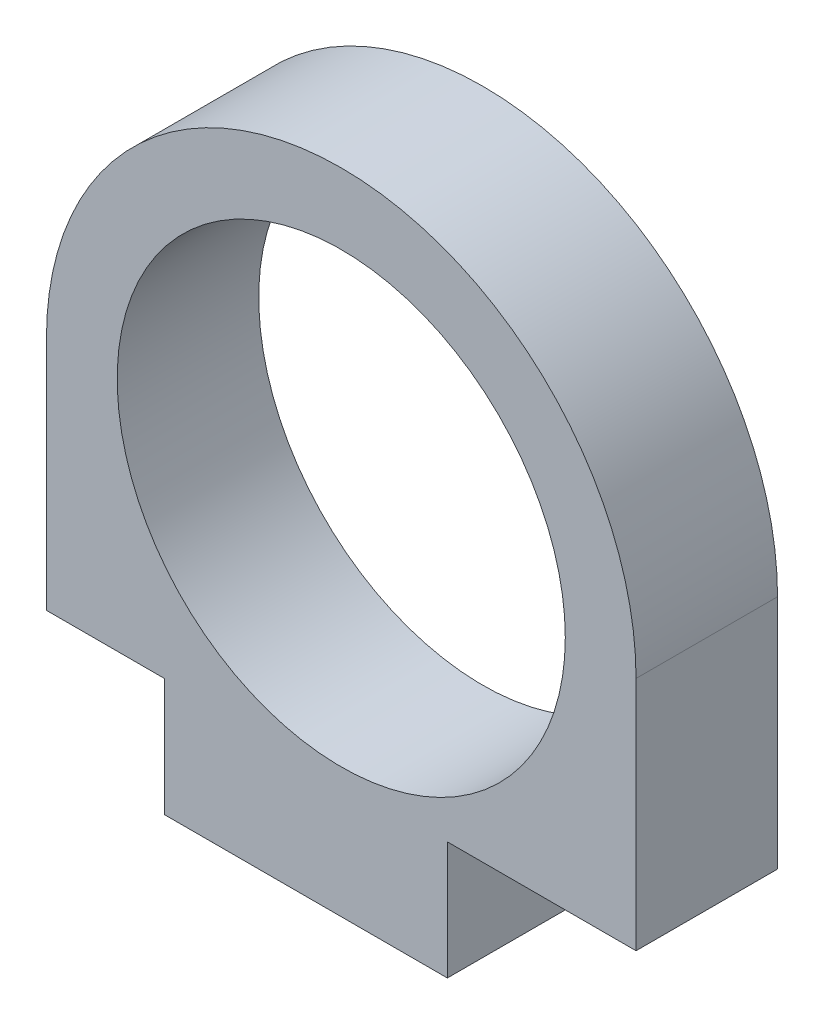
ISO-10303-21;
HEADER;
FILE_DESCRIPTION(('STEP AP214'),'2;1');
FILE_NAME('part.step','',(''),(''),'','','');
FILE_SCHEMA(('AUTOMOTIVE_DESIGN { 1 0 10303 214 1 1 1 1 }'));
ENDSEC;
DATA;
#1=APPLICATION_CONTEXT('core data for automotive mechanical design processes');
#2=APPLICATION_PROTOCOL_DEFINITION('international standard','automotive_design',2000,#1);
#3=PRODUCT_CONTEXT('',#1,'mechanical');
#4=PRODUCT('Part','Part','',(#3));
#5=PRODUCT_RELATED_PRODUCT_CATEGORY('part','',(#4));
#6=PRODUCT_DEFINITION_FORMATION('','',#4);
#7=PRODUCT_DEFINITION_CONTEXT('part definition',#1,'design');
#8=PRODUCT_DEFINITION('design','',#6,#7);
#9=PRODUCT_DEFINITION_SHAPE('','',#8);
#10=(LENGTH_UNIT() NAMED_UNIT(*) SI_UNIT(.MILLI.,.METRE.));
#11=(NAMED_UNIT(*) PLANE_ANGLE_UNIT() SI_UNIT($,.RADIAN.));
#12=(NAMED_UNIT(*) SI_UNIT($,.STERADIAN.) SOLID_ANGLE_UNIT());
#13=UNCERTAINTY_MEASURE_WITH_UNIT(LENGTH_MEASURE(1.E-05),#10,'distance_accuracy_value','');
#14=(GEOMETRIC_REPRESENTATION_CONTEXT(3) GLOBAL_UNCERTAINTY_ASSIGNED_CONTEXT((#13)) GLOBAL_UNIT_ASSIGNED_CONTEXT((#10,
#11,#12)) REPRESENTATION_CONTEXT('',''));
#15=CARTESIAN_POINT('',(0.,0.,0.));
#16=DIRECTION('',(0.,0.,1.));
#17=DIRECTION('',(1.,0.,0.));
#18=AXIS2_PLACEMENT_3D('',#15,#16,#17);
#19=CARTESIAN_POINT('',(0.,-10.,6.));
#20=DIRECTION('',(0.,1.,0.));
#21=DIRECTION('',(0.,0.,1.));
#22=AXIS2_PLACEMENT_3D('',#19,#20,#21);
#23=PLANE('',#22);
#24=DIRECTION('',(1.,0.,0.));
#25=VECTOR('',#24,1.);
#26=CARTESIAN_POINT('',(0.,-10.,0.));
#27=LINE('',#26,#25);
#28=CARTESIAN_POINT('',(-12.5,-10.,0.));
#29=VERTEX_POINT('',#28);
#30=CARTESIAN_POINT('',(-7.5,-10.,0.));
#31=VERTEX_POINT('',#30);
#32=EDGE_CURVE('E139',#29,#31,#27,.T.);
#33=ORIENTED_EDGE('',*,*,#32,.T.);
#34=DIRECTION('',(0.,0.,-1.));
#35=VECTOR('',#34,1.);
#36=CARTESIAN_POINT('',(-7.5,-10.,6.));
#37=LINE('',#36,#35);
#38=CARTESIAN_POINT('',(-7.5,-10.,6.));
#39=VERTEX_POINT('',#38);
#40=EDGE_CURVE('E11',#39,#31,#37,.T.);
#41=ORIENTED_EDGE('',*,*,#40,.F.);
#42=DIRECTION('',(1.,0.,0.));
#43=VECTOR('',#42,1.);
#44=CARTESIAN_POINT('',(0.,-10.,6.));
#45=LINE('',#44,#43);
#46=CARTESIAN_POINT('',(-12.5,-10.,6.));
#47=VERTEX_POINT('',#46);
#48=EDGE_CURVE('E130',#47,#39,#45,.T.);
#49=ORIENTED_EDGE('',*,*,#48,.F.);
#50=DIRECTION('',(0.,0.,-1.));
#51=VECTOR('',#50,1.);
#52=CARTESIAN_POINT('',(-12.5,-10.,6.));
#53=LINE('',#52,#51);
#54=EDGE_CURVE('E135',#47,#29,#53,.T.);
#55=ORIENTED_EDGE('',*,*,#54,.T.);
#56=EDGE_LOOP('',(#33,#41,#49,#55));
#57=FACE_BOUND('',#56,.T.);
#58=ADVANCED_FACE('F35',(#57),#23,.F.);
#59=CARTESIAN_POINT('',(-7.5,0.,6.));
#60=DIRECTION('',(1.,0.,0.));
#61=DIRECTION('',(0.,1.,0.));
#62=AXIS2_PLACEMENT_3D('',#59,#60,#61);
#63=PLANE('',#62);
#64=DIRECTION('',(0.,-1.,0.));
#65=VECTOR('',#64,1.);
#66=CARTESIAN_POINT('',(-7.5,0.,0.));
#67=LINE('',#66,#65);
#68=CARTESIAN_POINT('',(-7.5,-15.,0.));
#69=VERTEX_POINT('',#68);
#70=EDGE_CURVE('E142',#31,#69,#67,.T.);
#71=ORIENTED_EDGE('',*,*,#70,.T.);
#72=DIRECTION('',(0.,0.,-1.));
#73=VECTOR('',#72,1.);
#74=CARTESIAN_POINT('',(-7.5,-15.,6.));
#75=LINE('',#74,#73);
#76=CARTESIAN_POINT('',(-7.5,-15.,6.));
#77=VERTEX_POINT('',#76);
#78=EDGE_CURVE('E44',#77,#69,#75,.T.);
#79=ORIENTED_EDGE('',*,*,#78,.F.);
#80=DIRECTION('',(0.,-1.,0.));
#81=VECTOR('',#80,1.);
#82=CARTESIAN_POINT('',(-7.5,0.,6.));
#83=LINE('',#82,#81);
#84=EDGE_CURVE('E94',#39,#77,#83,.T.);
#85=ORIENTED_EDGE('',*,*,#84,.F.);
#86=ORIENTED_EDGE('',*,*,#40,.T.);
#87=EDGE_LOOP('',(#71,#79,#85,#86));
#88=FACE_BOUND('',#87,.T.);
#89=ADVANCED_FACE('F195',(#88),#63,.F.);
#90=CARTESIAN_POINT('',(0.,-15.,6.));
#91=DIRECTION('',(0.,1.,0.));
#92=DIRECTION('',(0.,0.,1.));
#93=AXIS2_PLACEMENT_3D('',#90,#91,#92);
#94=PLANE('',#93);
#95=DIRECTION('',(1.,0.,0.));
#96=VECTOR('',#95,1.);
#97=CARTESIAN_POINT('',(0.,-15.,0.));
#98=LINE('',#97,#96);
#99=CARTESIAN_POINT('',(4.5,-15.,0.));
#100=VERTEX_POINT('',#99);
#101=EDGE_CURVE('E145',#69,#100,#98,.T.);
#102=ORIENTED_EDGE('',*,*,#101,.T.);
#103=DIRECTION('',(0.,0.,-1.));
#104=VECTOR('',#103,1.);
#105=CARTESIAN_POINT('',(4.5,-15.,6.));
#106=LINE('',#105,#104);
#107=CARTESIAN_POINT('',(4.5,-15.,6.));
#108=VERTEX_POINT('',#107);
#109=EDGE_CURVE('E160',#108,#100,#106,.T.);
#110=ORIENTED_EDGE('',*,*,#109,.F.);
#111=DIRECTION('',(1.,0.,0.));
#112=VECTOR('',#111,1.);
#113=CARTESIAN_POINT('',(0.,-15.,6.));
#114=LINE('',#113,#112);
#115=EDGE_CURVE('E167',#77,#108,#114,.T.);
#116=ORIENTED_EDGE('',*,*,#115,.F.);
#117=ORIENTED_EDGE('',*,*,#78,.T.);
#118=EDGE_LOOP('',(#102,#110,#116,#117));
#119=FACE_BOUND('',#118,.T.);
#120=ADVANCED_FACE('F165',(#119),#94,.F.);
#121=CARTESIAN_POINT('',(4.5,0.,6.));
#122=DIRECTION('',(1.,0.,0.));
#123=DIRECTION('',(0.,0.,-1.));
#124=AXIS2_PLACEMENT_3D('',#121,#122,#123);
#125=PLANE('',#124);
#126=DIRECTION('',(0.,-1.,0.));
#127=VECTOR('',#126,1.);
#128=CARTESIAN_POINT('',(4.5,0.,0.));
#129=LINE('',#128,#127);
#130=CARTESIAN_POINT('',(4.5,-10.,0.));
#131=VERTEX_POINT('',#130);
#132=EDGE_CURVE('E148',#131,#100,#129,.T.);
#133=ORIENTED_EDGE('',*,*,#132,.F.);
#134=DIRECTION('',(0.,0.,-1.));
#135=VECTOR('',#134,1.);
#136=CARTESIAN_POINT('',(4.5,-10.,6.));
#137=LINE('',#136,#135);
#138=CARTESIAN_POINT('',(4.5,-10.,6.));
#139=VERTEX_POINT('',#138);
#140=EDGE_CURVE('E158',#139,#131,#137,.T.);
#141=ORIENTED_EDGE('',*,*,#140,.F.);
#142=DIRECTION('',(0.,-1.,0.));
#143=VECTOR('',#142,1.);
#144=CARTESIAN_POINT('',(4.5,0.,6.));
#145=LINE('',#144,#143);
#146=EDGE_CURVE('E128',#139,#108,#145,.T.);
#147=ORIENTED_EDGE('',*,*,#146,.T.);
#148=ORIENTED_EDGE('',*,*,#109,.T.);
#149=EDGE_LOOP('',(#133,#141,#147,#148));
#150=FACE_BOUND('',#149,.T.);
#151=ADVANCED_FACE('F175',(#150),#125,.T.);
#152=CARTESIAN_POINT('',(12.5,-10.,0.));
#153=VERTEX_POINT('',#152);
#154=EDGE_CURVE('E143',#131,#153,#27,.T.);
#155=ORIENTED_EDGE('',*,*,#154,.T.);
#156=DIRECTION('',(0.,0.,-1.));
#157=VECTOR('',#156,1.);
#158=CARTESIAN_POINT('',(12.5,-10.,6.));
#159=LINE('',#158,#157);
#160=CARTESIAN_POINT('',(12.5,-10.,6.));
#161=VERTEX_POINT('',#160);
#162=EDGE_CURVE('E116',#161,#153,#159,.T.);
#163=ORIENTED_EDGE('',*,*,#162,.F.);
#164=EDGE_CURVE('E125',#139,#161,#45,.T.);
#165=ORIENTED_EDGE('',*,*,#164,.F.);
#166=ORIENTED_EDGE('',*,*,#140,.T.);
#167=EDGE_LOOP('',(#155,#163,#165,#166));
#168=FACE_BOUND('',#167,.T.);
#169=ADVANCED_FACE('F198',(#168),#23,.F.);
#170=CARTESIAN_POINT('',(12.5,0.,6.));
#171=DIRECTION('',(1.,0.,0.));
#172=DIRECTION('',(0.,1.,0.));
#173=AXIS2_PLACEMENT_3D('',#170,#171,#172);
#174=PLANE('',#173);
#175=DIRECTION('',(0.,-1.,0.));
#176=VECTOR('',#175,1.);
#177=CARTESIAN_POINT('',(12.5,0.,0.));
#178=LINE('',#177,#176);
#179=CARTESIAN_POINT('',(12.5,0.,0.));
#180=VERTEX_POINT('',#179);
#181=EDGE_CURVE('E115',#180,#153,#178,.T.);
#182=ORIENTED_EDGE('',*,*,#181,.F.);
#183=DIRECTION('',(0.,0.,-1.));
#184=VECTOR('',#183,1.);
#185=CARTESIAN_POINT('',(12.5,0.,6.));
#186=LINE('',#185,#184);
#187=CARTESIAN_POINT('',(12.5,0.,6.));
#188=VERTEX_POINT('',#187);
#189=EDGE_CURVE('E109',#188,#180,#186,.T.);
#190=ORIENTED_EDGE('',*,*,#189,.F.);
#191=DIRECTION('',(0.,-1.,0.));
#192=VECTOR('',#191,1.);
#193=CARTESIAN_POINT('',(12.5,0.,6.));
#194=LINE('',#193,#192);
#195=EDGE_CURVE('E113',#188,#161,#194,.T.);
#196=ORIENTED_EDGE('',*,*,#195,.T.);
#197=ORIENTED_EDGE('',*,*,#162,.T.);
#198=EDGE_LOOP('',(#182,#190,#196,#197));
#199=FACE_BOUND('',#198,.T.);
#200=ADVANCED_FACE('F111',(#199),#174,.T.);
#201=CARTESIAN_POINT('',(0.,0.,6.));
#202=DIRECTION('',(0.,0.,-1.));
#203=DIRECTION('',(-1.,0.,0.));
#204=AXIS2_PLACEMENT_3D('',#201,#202,#203);
#205=CYLINDRICAL_SURFACE('',#204,12.5);
#206=CARTESIAN_POINT('',(0.,0.,0.));
#207=DIRECTION('',(0.,0.,1.));
#208=DIRECTION('',(1.,0.,0.));
#209=AXIS2_PLACEMENT_3D('',#206,#207,#208);
#210=CIRCLE('',#209,12.5);
#211=CARTESIAN_POINT('',(-12.5,0.,0.));
#212=VERTEX_POINT('',#211);
#213=EDGE_CURVE('E80',#180,#212,#210,.T.);
#214=ORIENTED_EDGE('',*,*,#213,.T.);
#215=DIRECTION('',(0.,0.,-1.));
#216=VECTOR('',#215,1.);
#217=CARTESIAN_POINT('',(-12.5,0.,6.));
#218=LINE('',#217,#216);
#219=CARTESIAN_POINT('',(-12.5,0.,6.));
#220=VERTEX_POINT('',#219);
#221=EDGE_CURVE('E117',#220,#212,#218,.T.);
#222=ORIENTED_EDGE('',*,*,#221,.F.);
#223=CARTESIAN_POINT('',(0.,0.,6.));
#224=DIRECTION('',(0.,0.,1.));
#225=DIRECTION('',(1.,0.,0.));
#226=AXIS2_PLACEMENT_3D('',#223,#224,#225);
#227=CIRCLE('',#226,12.5);
#228=EDGE_CURVE('E119',#188,#220,#227,.T.);
#229=ORIENTED_EDGE('',*,*,#228,.F.);
#230=ORIENTED_EDGE('',*,*,#189,.T.);
#231=EDGE_LOOP('',(#214,#222,#229,#230));
#232=FACE_BOUND('',#231,.T.);
#233=ADVANCED_FACE('F120',(#232),#205,.T.);
#234=CARTESIAN_POINT('',(0.,0.,6.));
#235=DIRECTION('',(0.,0.,-1.));
#236=DIRECTION('',(-1.,0.,0.));
#237=AXIS2_PLACEMENT_3D('',#234,#235,#236);
#238=CYLINDRICAL_SURFACE('',#237,9.5);
#239=CARTESIAN_POINT('',(0.,0.,6.));
#240=DIRECTION('',(0.,0.,1.));
#241=DIRECTION('',(1.,0.,0.));
#242=AXIS2_PLACEMENT_3D('',#239,#240,#241);
#243=CIRCLE('',#242,9.5);
#244=CARTESIAN_POINT('',(9.5,0.,6.));
#245=VERTEX_POINT('',#244);
#246=EDGE_CURVE('E154',#245,#245,#243,.T.);
#247=ORIENTED_EDGE('',*,*,#246,.T.);
#248=EDGE_LOOP('',(#247));
#249=FACE_BOUND('',#248,.T.);
#250=CARTESIAN_POINT('',(0.,0.,0.));
#251=DIRECTION('',(0.,0.,1.));
#252=DIRECTION('',(1.,0.,0.));
#253=AXIS2_PLACEMENT_3D('',#250,#251,#252);
#254=CIRCLE('',#253,9.5);
#255=CARTESIAN_POINT('',(9.5,0.,0.));
#256=VERTEX_POINT('',#255);
#257=EDGE_CURVE('E136',#256,#256,#254,.T.);
#258=ORIENTED_EDGE('',*,*,#257,.F.);
#259=EDGE_LOOP('',(#258));
#260=FACE_BOUND('',#259,.T.);
#261=ADVANCED_FACE('F37',(#249,#260),#238,.F.);
#262=CARTESIAN_POINT('',(-12.5,0.,6.));
#263=DIRECTION('',(1.,0.,0.));
#264=DIRECTION('',(0.,1.,0.));
#265=AXIS2_PLACEMENT_3D('',#262,#263,#264);
#266=PLANE('',#265);
#267=DIRECTION('',(0.,-1.,0.));
#268=VECTOR('',#267,1.);
#269=CARTESIAN_POINT('',(-12.5,0.,0.));
#270=LINE('',#269,#268);
#271=EDGE_CURVE('E86',#212,#29,#270,.T.);
#272=ORIENTED_EDGE('',*,*,#271,.T.);
#273=ORIENTED_EDGE('',*,*,#54,.F.);
#274=DIRECTION('',(0.,-1.,0.));
#275=VECTOR('',#274,1.);
#276=CARTESIAN_POINT('',(-12.5,0.,6.));
#277=LINE('',#276,#275);
#278=EDGE_CURVE('E52',#220,#47,#277,.T.);
#279=ORIENTED_EDGE('',*,*,#278,.F.);
#280=ORIENTED_EDGE('',*,*,#221,.T.);
#281=EDGE_LOOP('',(#272,#273,#279,#280));
#282=FACE_BOUND('',#281,.T.);
#283=ADVANCED_FACE('F185',(#282),#266,.F.);
#284=CARTESIAN_POINT('',(0.,0.,6.));
#285=DIRECTION('',(0.,0.,1.));
#286=DIRECTION('',(1.,0.,0.));
#287=AXIS2_PLACEMENT_3D('',#284,#285,#286);
#288=PLANE('',#287);
#289=ORIENTED_EDGE('',*,*,#246,.F.);
#290=EDGE_LOOP('',(#289));
#291=FACE_BOUND('',#290,.T.);
#292=ORIENTED_EDGE('',*,*,#48,.T.);
#293=ORIENTED_EDGE('',*,*,#84,.T.);
#294=ORIENTED_EDGE('',*,*,#115,.T.);
#295=ORIENTED_EDGE('',*,*,#146,.F.);
#296=ORIENTED_EDGE('',*,*,#164,.T.);
#297=ORIENTED_EDGE('',*,*,#195,.F.);
#298=ORIENTED_EDGE('',*,*,#228,.T.);
#299=ORIENTED_EDGE('',*,*,#278,.T.);
#300=EDGE_LOOP('',(#292,#293,#294,#295,#296,#297,#298,#299));
#301=FACE_BOUND('',#300,.T.);
#302=ADVANCED_FACE('F122',(#291,#301),#288,.T.);
#303=CARTESIAN_POINT('',(0.,0.,0.));
#304=DIRECTION('',(0.,0.,1.));
#305=DIRECTION('',(1.,0.,0.));
#306=AXIS2_PLACEMENT_3D('',#303,#304,#305);
#307=PLANE('',#306);
#308=ORIENTED_EDGE('',*,*,#257,.T.);
#309=EDGE_LOOP('',(#308));
#310=FACE_BOUND('',#309,.T.);
#311=ORIENTED_EDGE('',*,*,#32,.F.);
#312=ORIENTED_EDGE('',*,*,#271,.F.);
#313=ORIENTED_EDGE('',*,*,#213,.F.);
#314=ORIENTED_EDGE('',*,*,#181,.T.);
#315=ORIENTED_EDGE('',*,*,#154,.F.);
#316=ORIENTED_EDGE('',*,*,#132,.T.);
#317=ORIENTED_EDGE('',*,*,#101,.F.);
#318=ORIENTED_EDGE('',*,*,#70,.F.);
#319=EDGE_LOOP('',(#311,#312,#313,#314,#315,#316,#317,#318));
#320=FACE_BOUND('',#319,.T.);
#321=ADVANCED_FACE('F170',(#310,#320),#307,.F.);
#322=CLOSED_SHELL('',(#58,#89,#120,#151,#169,#200,#233,#261,#283,#302,#321));
#323=MANIFOLD_SOLID_BREP('B2',#322);
#324=ADVANCED_BREP_SHAPE_REPRESENTATION('',(#18,#323),#14);
#325=SHAPE_DEFINITION_REPRESENTATION(#9,#324);
ENDSEC;
END-ISO-10303-21;
